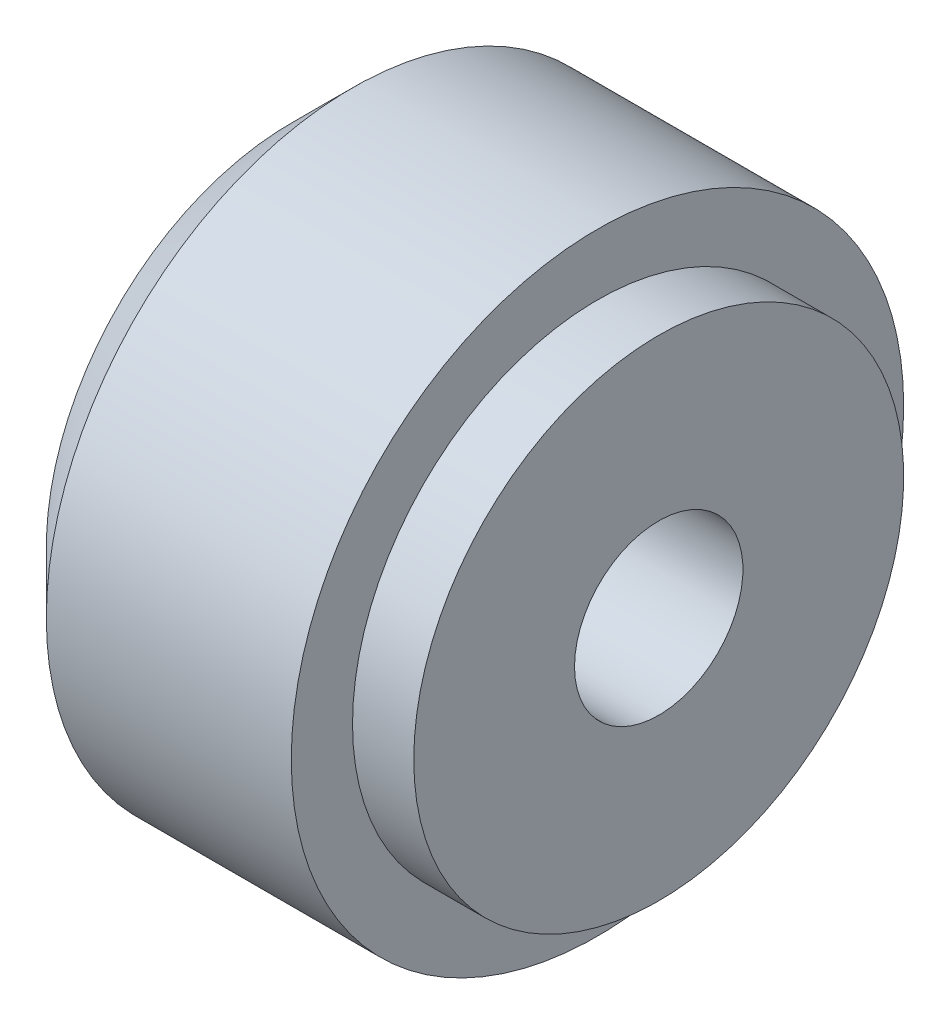
ISO-10303-21;
HEADER;
FILE_DESCRIPTION(('STEP AP214'),'2;1');
FILE_NAME('part.step','',(''),(''),'','','');
FILE_SCHEMA(('AUTOMOTIVE_DESIGN { 1 0 10303 214 1 1 1 1 }'));
ENDSEC;
DATA;
#1=APPLICATION_CONTEXT('core data for automotive mechanical design processes');
#2=APPLICATION_PROTOCOL_DEFINITION('international standard','automotive_design',2000,#1);
#3=PRODUCT_CONTEXT('',#1,'mechanical');
#4=PRODUCT('Part','Part','',(#3));
#5=PRODUCT_RELATED_PRODUCT_CATEGORY('part','',(#4));
#6=PRODUCT_DEFINITION_FORMATION('','',#4);
#7=PRODUCT_DEFINITION_CONTEXT('part definition',#1,'design');
#8=PRODUCT_DEFINITION('design','',#6,#7);
#9=PRODUCT_DEFINITION_SHAPE('','',#8);
#10=(LENGTH_UNIT() NAMED_UNIT(*) SI_UNIT(.MILLI.,.METRE.));
#11=(NAMED_UNIT(*) PLANE_ANGLE_UNIT() SI_UNIT($,.RADIAN.));
#12=(NAMED_UNIT(*) SI_UNIT($,.STERADIAN.) SOLID_ANGLE_UNIT());
#13=UNCERTAINTY_MEASURE_WITH_UNIT(LENGTH_MEASURE(1.E-05),#10,'distance_accuracy_value','');
#14=(GEOMETRIC_REPRESENTATION_CONTEXT(3) GLOBAL_UNCERTAINTY_ASSIGNED_CONTEXT((#13)) GLOBAL_UNIT_ASSIGNED_CONTEXT((#10,
#11,#12)) REPRESENTATION_CONTEXT('',''));
#15=CARTESIAN_POINT('',(0.,0.,0.));
#16=DIRECTION('',(0.,0.,1.));
#17=DIRECTION('',(1.,0.,0.));
#18=AXIS2_PLACEMENT_3D('',#15,#16,#17);
#19=CARTESIAN_POINT('',(0.,0.,0.));
#20=DIRECTION('',(-1.,0.,0.));
#21=DIRECTION('',(0.,0.,1.));
#22=AXIS2_PLACEMENT_3D('',#19,#20,#21);
#23=PLANE('',#22);
#24=CARTESIAN_POINT('',(0.,0.,0.));
#25=DIRECTION('',(-1.,0.,0.));
#26=DIRECTION('',(0.,0.,1.));
#27=AXIS2_PLACEMENT_3D('',#24,#25,#26);
#28=CIRCLE('',#27,2.75);
#29=CARTESIAN_POINT('',(0.,0.,2.75));
#30=VERTEX_POINT('',#29);
#31=EDGE_CURVE('E63',#30,#30,#28,.T.);
#32=ORIENTED_EDGE('',*,*,#31,.T.);
#33=EDGE_LOOP('',(#32));
#34=FACE_BOUND('',#33,.T.);
#35=CARTESIAN_POINT('',(0.,0.,0.));
#36=DIRECTION('',(-1.,0.,0.));
#37=DIRECTION('',(0.,0.,1.));
#38=AXIS2_PLACEMENT_3D('',#35,#36,#37);
#39=CIRCLE('',#38,8.);
#40=CARTESIAN_POINT('',(0.,0.,8.));
#41=VERTEX_POINT('',#40);
#42=EDGE_CURVE('E51',#41,#41,#39,.T.);
#43=ORIENTED_EDGE('',*,*,#42,.F.);
#44=EDGE_LOOP('',(#43));
#45=FACE_BOUND('',#44,.T.);
#46=ADVANCED_FACE('F39',(#34,#45),#23,.F.);
#47=CARTESIAN_POINT('',(0.,0.,0.));
#48=DIRECTION('',(-1.,0.,0.));
#49=DIRECTION('',(0.,0.,1.));
#50=AXIS2_PLACEMENT_3D('',#47,#48,#49);
#51=CYLINDRICAL_SURFACE('',#50,8.);
#52=CARTESIAN_POINT('',(-2.,0.,0.));
#53=DIRECTION('',(-1.,0.,0.));
#54=DIRECTION('',(0.,0.,1.));
#55=AXIS2_PLACEMENT_3D('',#52,#53,#54);
#56=CIRCLE('',#55,8.);
#57=CARTESIAN_POINT('',(-2.,0.,8.));
#58=VERTEX_POINT('',#57);
#59=EDGE_CURVE('E55',#58,#58,#56,.T.);
#60=ORIENTED_EDGE('',*,*,#59,.F.);
#61=EDGE_LOOP('',(#60));
#62=FACE_BOUND('',#61,.T.);
#63=ORIENTED_EDGE('',*,*,#42,.T.);
#64=EDGE_LOOP('',(#63));
#65=FACE_BOUND('',#64,.T.);
#66=ADVANCED_FACE('F93',(#62,#65),#51,.T.);
#67=CARTESIAN_POINT('',(-2.,8.,0.));
#68=DIRECTION('',(-1.,0.,0.));
#69=DIRECTION('',(0.,0.,1.));
#70=AXIS2_PLACEMENT_3D('',#67,#68,#69);
#71=PLANE('',#70);
#72=CARTESIAN_POINT('',(-2.,0.,0.));
#73=DIRECTION('',(-1.,0.,0.));
#74=DIRECTION('',(0.,0.,1.));
#75=AXIS2_PLACEMENT_3D('',#72,#73,#74);
#76=CIRCLE('',#75,10.);
#77=CARTESIAN_POINT('',(-2.,0.,10.));
#78=VERTEX_POINT('',#77);
#79=EDGE_CURVE('E60',#78,#78,#76,.T.);
#80=ORIENTED_EDGE('',*,*,#79,.F.);
#81=EDGE_LOOP('',(#80));
#82=FACE_BOUND('',#81,.T.);
#83=ORIENTED_EDGE('',*,*,#59,.T.);
#84=EDGE_LOOP('',(#83));
#85=FACE_BOUND('',#84,.T.);
#86=ADVANCED_FACE('F90',(#82,#85),#71,.F.);
#87=CARTESIAN_POINT('',(0.,0.,0.));
#88=DIRECTION('',(-1.,0.,0.));
#89=DIRECTION('',(0.,0.,1.));
#90=AXIS2_PLACEMENT_3D('',#87,#88,#89);
#91=CYLINDRICAL_SURFACE('',#90,10.);
#92=CARTESIAN_POINT('',(-9.99999999999999,0.,0.));
#93=DIRECTION('',(1.,0.,0.));
#94=DIRECTION('',(0.,0.,-1.));
#95=AXIS2_PLACEMENT_3D('',#92,#93,#94);
#96=CIRCLE('',#95,10.);
#97=CARTESIAN_POINT('',(-9.99999999999999,0.,-10.));
#98=VERTEX_POINT('',#97);
#99=EDGE_CURVE('E10',#98,#98,#96,.T.);
#100=ORIENTED_EDGE('',*,*,#99,.T.);
#101=EDGE_LOOP('',(#100));
#102=FACE_BOUND('',#101,.T.);
#103=ORIENTED_EDGE('',*,*,#79,.T.);
#104=EDGE_LOOP('',(#103));
#105=FACE_BOUND('',#104,.T.);
#106=ADVANCED_FACE('F80',(#102,#105),#91,.T.);
#107=CARTESIAN_POINT('',(-12.,10.,0.));
#108=DIRECTION('',(1.,0.,0.));
#109=DIRECTION('',(0.,0.,-1.));
#110=AXIS2_PLACEMENT_3D('',#107,#108,#109);
#111=PLANE('',#110);
#112=CARTESIAN_POINT('',(-12.,0.,0.));
#113=DIRECTION('',(-1.,0.,0.));
#114=DIRECTION('',(0.,0.,1.));
#115=AXIS2_PLACEMENT_3D('',#112,#113,#114);
#116=CIRCLE('',#115,4.99999999999999);
#117=CARTESIAN_POINT('',(-12.,0.,4.99999999999999));
#118=VERTEX_POINT('',#117);
#119=EDGE_CURVE('E72',#118,#118,#116,.T.);
#120=ORIENTED_EDGE('',*,*,#119,.F.);
#121=EDGE_LOOP('',(#120));
#122=FACE_BOUND('',#121,.T.);
#123=CARTESIAN_POINT('',(-12.,0.,0.));
#124=DIRECTION('',(1.,0.,0.));
#125=DIRECTION('',(0.,0.,-1.));
#126=AXIS2_PLACEMENT_3D('',#123,#124,#125);
#127=CIRCLE('',#126,8.);
#128=CARTESIAN_POINT('',(-12.,0.,-8.));
#129=VERTEX_POINT('',#128);
#130=EDGE_CURVE('E47',#129,#129,#127,.F.);
#131=ORIENTED_EDGE('',*,*,#130,.T.);
#132=EDGE_LOOP('',(#131));
#133=FACE_BOUND('',#132,.T.);
#134=ADVANCED_FACE('F78',(#122,#133),#111,.F.);
#135=CARTESIAN_POINT('',(-12.,0.,0.));
#136=DIRECTION('',(1.,0.,0.));
#137=DIRECTION('',(0.,0.,-1.));
#138=AXIS2_PLACEMENT_3D('',#135,#136,#137);
#139=CONICAL_SURFACE('',#138,8.,0.785398163397446);
#140=ORIENTED_EDGE('',*,*,#99,.F.);
#141=EDGE_LOOP('',(#140));
#142=FACE_BOUND('',#141,.T.);
#143=ORIENTED_EDGE('',*,*,#130,.F.);
#144=EDGE_LOOP('',(#143));
#145=FACE_BOUND('',#144,.T.);
#146=ADVANCED_FACE('F42',(#142,#145),#139,.T.);
#147=CARTESIAN_POINT('',(-12.,0.,0.));
#148=DIRECTION('',(-1.,0.,0.));
#149=DIRECTION('',(0.,0.,1.));
#150=AXIS2_PLACEMENT_3D('',#147,#148,#149);
#151=CYLINDRICAL_SURFACE('',#150,2.75);
#152=ORIENTED_EDGE('',*,*,#31,.F.);
#153=EDGE_LOOP('',(#152));
#154=FACE_BOUND('',#153,.T.);
#155=CARTESIAN_POINT('',(-6.6,0.,0.));
#156=DIRECTION('',(-1.,0.,0.));
#157=DIRECTION('',(0.,0.,1.));
#158=AXIS2_PLACEMENT_3D('',#155,#156,#157);
#159=CIRCLE('',#158,2.75);
#160=CARTESIAN_POINT('',(-6.6,0.,2.75));
#161=VERTEX_POINT('',#160);
#162=EDGE_CURVE('E66',#161,#161,#159,.T.);
#163=ORIENTED_EDGE('',*,*,#162,.T.);
#164=EDGE_LOOP('',(#163));
#165=FACE_BOUND('',#164,.T.);
#166=ADVANCED_FACE('F87',(#154,#165),#151,.F.);
#167=CARTESIAN_POINT('',(-6.6,2.75,0.));
#168=DIRECTION('',(1.,0.,0.));
#169=DIRECTION('',(0.,0.,-1.));
#170=AXIS2_PLACEMENT_3D('',#167,#168,#169);
#171=PLANE('',#170);
#172=ORIENTED_EDGE('',*,*,#162,.F.);
#173=EDGE_LOOP('',(#172));
#174=FACE_BOUND('',#173,.T.);
#175=CARTESIAN_POINT('',(-6.6,0.,0.));
#176=DIRECTION('',(-1.,0.,0.));
#177=DIRECTION('',(0.,0.,1.));
#178=AXIS2_PLACEMENT_3D('',#175,#176,#177);
#179=CIRCLE('',#178,5.);
#180=CARTESIAN_POINT('',(-6.6,0.,5.));
#181=VERTEX_POINT('',#180);
#182=EDGE_CURVE('E69',#181,#181,#179,.T.);
#183=ORIENTED_EDGE('',*,*,#182,.T.);
#184=EDGE_LOOP('',(#183));
#185=FACE_BOUND('',#184,.T.);
#186=ADVANCED_FACE('F136',(#174,#185),#171,.F.);
#187=CARTESIAN_POINT('',(-12.,0.,0.));
#188=DIRECTION('',(-1.,0.,0.));
#189=DIRECTION('',(0.,0.,1.));
#190=AXIS2_PLACEMENT_3D('',#187,#188,#189);
#191=CYLINDRICAL_SURFACE('',#190,4.99999999999999);
#192=ORIENTED_EDGE('',*,*,#182,.F.);
#193=EDGE_LOOP('',(#192));
#194=FACE_BOUND('',#193,.T.);
#195=ORIENTED_EDGE('',*,*,#119,.T.);
#196=EDGE_LOOP('',(#195));
#197=FACE_BOUND('',#196,.T.);
#198=ADVANCED_FACE('F76',(#194,#197),#191,.F.);
#199=CLOSED_SHELL('',(#46,#66,#86,#106,#134,#146,#166,#186,#198));
#200=MANIFOLD_SOLID_BREP('B2',#199);
#201=ADVANCED_BREP_SHAPE_REPRESENTATION('',(#18,#200),#14);
#202=SHAPE_DEFINITION_REPRESENTATION(#9,#201);
ENDSEC;
END-ISO-10303-21;
